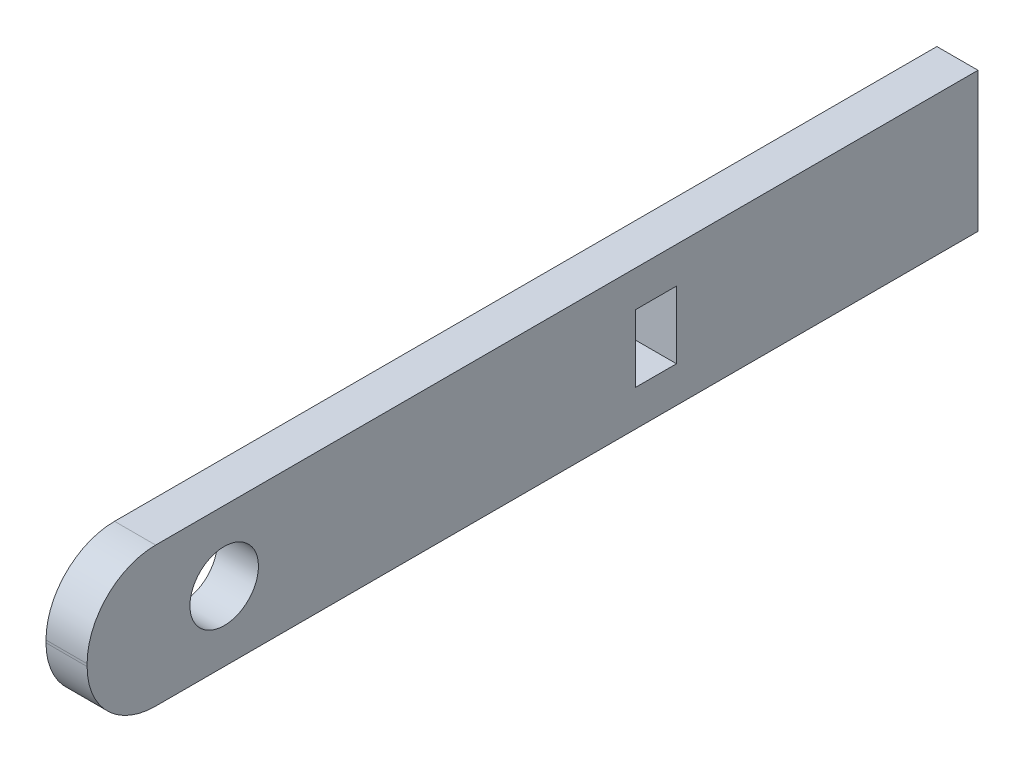
ISO-10303-21;
HEADER;
FILE_DESCRIPTION(('STEP AP214'),'2;1');
FILE_NAME('part.step','',(''),(''),'','','');
FILE_SCHEMA(('AUTOMOTIVE_DESIGN { 1 0 10303 214 1 1 1 1 }'));
ENDSEC;
DATA;
#1=APPLICATION_CONTEXT('core data for automotive mechanical design processes');
#2=APPLICATION_PROTOCOL_DEFINITION('international standard','automotive_design',2000,#1);
#3=PRODUCT_CONTEXT('',#1,'mechanical');
#4=PRODUCT('Part','Part','',(#3));
#5=PRODUCT_RELATED_PRODUCT_CATEGORY('part','',(#4));
#6=PRODUCT_DEFINITION_FORMATION('','',#4);
#7=PRODUCT_DEFINITION_CONTEXT('part definition',#1,'design');
#8=PRODUCT_DEFINITION('design','',#6,#7);
#9=PRODUCT_DEFINITION_SHAPE('','',#8);
#10=(LENGTH_UNIT() NAMED_UNIT(*) SI_UNIT(.MILLI.,.METRE.));
#11=(NAMED_UNIT(*) PLANE_ANGLE_UNIT() SI_UNIT($,.RADIAN.));
#12=(NAMED_UNIT(*) SI_UNIT($,.STERADIAN.) SOLID_ANGLE_UNIT());
#13=UNCERTAINTY_MEASURE_WITH_UNIT(LENGTH_MEASURE(1.E-05),#10,'distance_accuracy_value','');
#14=(GEOMETRIC_REPRESENTATION_CONTEXT(3) GLOBAL_UNCERTAINTY_ASSIGNED_CONTEXT((#13)) GLOBAL_UNIT_ASSIGNED_CONTEXT((#10,
#11,#12)) REPRESENTATION_CONTEXT('',''));
#15=CARTESIAN_POINT('',(0.,0.,0.));
#16=DIRECTION('',(0.,0.,1.));
#17=DIRECTION('',(1.,0.,0.));
#18=AXIS2_PLACEMENT_3D('',#15,#16,#17);
#19=CARTESIAN_POINT('',(3.,0.,0.));
#20=DIRECTION('',(0.,0.,-1.));
#21=DIRECTION('',(-1.,0.,0.));
#22=AXIS2_PLACEMENT_3D('',#19,#20,#21);
#23=PLANE('',#22);
#24=DIRECTION('',(0.,-1.,0.));
#25=VECTOR('',#24,1.);
#26=CARTESIAN_POINT('',(0.,0.,0.));
#27=LINE('',#26,#25);
#28=CARTESIAN_POINT('',(0.,5.18,0.));
#29=VERTEX_POINT('',#28);
#30=CARTESIAN_POINT('',(0.,5.,0.));
#31=VERTEX_POINT('',#30);
#32=EDGE_CURVE('E151',#29,#31,#27,.T.);
#33=ORIENTED_EDGE('',*,*,#32,.T.);
#34=DIRECTION('',(-1.,0.,0.));
#35=VECTOR('',#34,1.);
#36=CARTESIAN_POINT('',(3.,5.,0.));
#37=LINE('',#36,#35);
#38=CARTESIAN_POINT('',(3.,5.,0.));
#39=VERTEX_POINT('',#38);
#40=EDGE_CURVE('E187',#31,#39,#37,.F.);
#41=ORIENTED_EDGE('',*,*,#40,.T.);
#42=DIRECTION('',(0.,-1.,0.));
#43=VECTOR('',#42,1.);
#44=CARTESIAN_POINT('',(3.,0.,0.));
#45=LINE('',#44,#43);
#46=CARTESIAN_POINT('',(3.,5.18,0.));
#47=VERTEX_POINT('',#46);
#48=EDGE_CURVE('E152',#47,#39,#45,.T.);
#49=ORIENTED_EDGE('',*,*,#48,.F.);
#50=DIRECTION('',(-1.,0.,0.));
#51=VECTOR('',#50,1.);
#52=CARTESIAN_POINT('',(3.,5.18,0.));
#53=LINE('',#52,#51);
#54=EDGE_CURVE('E184',#47,#29,#53,.T.);
#55=ORIENTED_EDGE('',*,*,#54,.T.);
#56=EDGE_LOOP('',(#33,#41,#49,#55));
#57=FACE_BOUND('',#56,.T.);
#58=ADVANCED_FACE('F33',(#57),#23,.F.);
#59=CARTESIAN_POINT('',(3.,0.,0.));
#60=DIRECTION('',(0.,1.,0.));
#61=DIRECTION('',(0.,0.,1.));
#62=AXIS2_PLACEMENT_3D('',#59,#60,#61);
#63=PLANE('',#62);
#64=DIRECTION('',(0.,0.,-1.));
#65=VECTOR('',#64,1.);
#66=CARTESIAN_POINT('',(3.,0.,0.));
#67=LINE('',#66,#65);
#68=CARTESIAN_POINT('',(3.,0.,-5.));
#69=VERTEX_POINT('',#68);
#70=CARTESIAN_POINT('',(3.,0.,-65.));
#71=VERTEX_POINT('',#70);
#72=EDGE_CURVE('E155',#69,#71,#67,.T.);
#73=ORIENTED_EDGE('',*,*,#72,.F.);
#74=DIRECTION('',(-1.,0.,0.));
#75=VECTOR('',#74,1.);
#76=CARTESIAN_POINT('',(3.,0.,-5.));
#77=LINE('',#76,#75);
#78=CARTESIAN_POINT('',(0.,0.,-5.));
#79=VERTEX_POINT('',#78);
#80=EDGE_CURVE('E177',#69,#79,#77,.T.);
#81=ORIENTED_EDGE('',*,*,#80,.T.);
#82=DIRECTION('',(0.,0.,-1.));
#83=VECTOR('',#82,1.);
#84=CARTESIAN_POINT('',(0.,0.,0.));
#85=LINE('',#84,#83);
#86=CARTESIAN_POINT('',(0.,0.,-65.));
#87=VERTEX_POINT('',#86);
#88=EDGE_CURVE('E166',#79,#87,#85,.T.);
#89=ORIENTED_EDGE('',*,*,#88,.T.);
#90=DIRECTION('',(-1.,0.,0.));
#91=VECTOR('',#90,1.);
#92=CARTESIAN_POINT('',(3.,0.,-65.));
#93=LINE('',#92,#91);
#94=EDGE_CURVE('E174',#71,#87,#93,.T.);
#95=ORIENTED_EDGE('',*,*,#94,.F.);
#96=EDGE_LOOP('',(#73,#81,#89,#95));
#97=FACE_BOUND('',#96,.T.);
#98=ADVANCED_FACE('F200',(#97),#63,.F.);
#99=CARTESIAN_POINT('',(3.,0.,-65.));
#100=DIRECTION('',(0.,0.,1.));
#101=DIRECTION('',(1.,0.,0.));
#102=AXIS2_PLACEMENT_3D('',#99,#100,#101);
#103=PLANE('',#102);
#104=DIRECTION('',(0.,1.,0.));
#105=VECTOR('',#104,1.);
#106=CARTESIAN_POINT('',(0.,0.,-65.));
#107=LINE('',#106,#105);
#108=CARTESIAN_POINT('',(0.,10.18,-65.));
#109=VERTEX_POINT('',#108);
#110=EDGE_CURVE('E168',#87,#109,#107,.T.);
#111=ORIENTED_EDGE('',*,*,#110,.T.);
#112=DIRECTION('',(-1.,0.,0.));
#113=VECTOR('',#112,1.);
#114=CARTESIAN_POINT('',(3.,10.18,-65.));
#115=LINE('',#114,#113);
#116=CARTESIAN_POINT('',(3.,10.18,-65.));
#117=VERTEX_POINT('',#116);
#118=EDGE_CURVE('E163',#117,#109,#115,.T.);
#119=ORIENTED_EDGE('',*,*,#118,.F.);
#120=DIRECTION('',(0.,1.,0.));
#121=VECTOR('',#120,1.);
#122=CARTESIAN_POINT('',(3.,0.,-65.));
#123=LINE('',#122,#121);
#124=EDGE_CURVE('E158',#71,#117,#123,.T.);
#125=ORIENTED_EDGE('',*,*,#124,.F.);
#126=ORIENTED_EDGE('',*,*,#94,.T.);
#127=EDGE_LOOP('',(#111,#119,#125,#126));
#128=FACE_BOUND('',#127,.T.);
#129=ADVANCED_FACE('F218',(#128),#103,.F.);
#130=CARTESIAN_POINT('',(3.,10.18,0.));
#131=DIRECTION('',(0.,-1.,0.));
#132=DIRECTION('',(0.,0.,-1.));
#133=AXIS2_PLACEMENT_3D('',#130,#131,#132);
#134=PLANE('',#133);
#135=DIRECTION('',(0.,0.,1.));
#136=VECTOR('',#135,1.);
#137=CARTESIAN_POINT('',(0.,10.18,0.));
#138=LINE('',#137,#136);
#139=CARTESIAN_POINT('',(0.,10.18,-5.));
#140=VERTEX_POINT('',#139);
#141=EDGE_CURVE('E156',#109,#140,#138,.T.);
#142=ORIENTED_EDGE('',*,*,#141,.T.);
#143=DIRECTION('',(-1.,0.,0.));
#144=VECTOR('',#143,1.);
#145=CARTESIAN_POINT('',(3.,10.18,-5.));
#146=LINE('',#145,#144);
#147=CARTESIAN_POINT('',(3.,10.18,-5.));
#148=VERTEX_POINT('',#147);
#149=EDGE_CURVE('E11',#140,#148,#146,.F.);
#150=ORIENTED_EDGE('',*,*,#149,.T.);
#151=DIRECTION('',(0.,0.,1.));
#152=VECTOR('',#151,1.);
#153=CARTESIAN_POINT('',(3.,10.18,0.));
#154=LINE('',#153,#152);
#155=EDGE_CURVE('E160',#117,#148,#154,.T.);
#156=ORIENTED_EDGE('',*,*,#155,.F.);
#157=ORIENTED_EDGE('',*,*,#118,.T.);
#158=EDGE_LOOP('',(#142,#150,#156,#157));
#159=FACE_BOUND('',#158,.T.);
#160=ADVANCED_FACE('F214',(#159),#134,.F.);
#161=CARTESIAN_POINT('',(3.,0.,0.));
#162=DIRECTION('',(-1.,0.,0.));
#163=DIRECTION('',(0.,0.,1.));
#164=AXIS2_PLACEMENT_3D('',#161,#162,#163);
#165=PLANE('',#164);
#166=DIRECTION('',(0.,0.,-1.));
#167=VECTOR('',#166,1.);
#168=CARTESIAN_POINT('',(3.,2.635,-40.));
#169=LINE('',#168,#167);
#170=CARTESIAN_POINT('',(3.,2.635,-40.));
#171=VERTEX_POINT('',#170);
#172=CARTESIAN_POINT('',(3.,2.635,-43.));
#173=VERTEX_POINT('',#172);
#174=EDGE_CURVE('E136',#171,#173,#169,.T.);
#175=ORIENTED_EDGE('',*,*,#174,.F.);
#176=DIRECTION('',(0.,-1.,0.));
#177=VECTOR('',#176,1.);
#178=CARTESIAN_POINT('',(3.,2.635,-40.));
#179=LINE('',#178,#177);
#180=CARTESIAN_POINT('',(3.,7.545,-40.));
#181=VERTEX_POINT('',#180);
#182=EDGE_CURVE('E48',#181,#171,#179,.T.);
#183=ORIENTED_EDGE('',*,*,#182,.F.);
#184=DIRECTION('',(0.,0.,1.));
#185=VECTOR('',#184,1.);
#186=CARTESIAN_POINT('',(3.,7.545,-40.));
#187=LINE('',#186,#185);
#188=CARTESIAN_POINT('',(3.,7.545,-43.));
#189=VERTEX_POINT('',#188);
#190=EDGE_CURVE('E127',#189,#181,#187,.T.);
#191=ORIENTED_EDGE('',*,*,#190,.F.);
#192=DIRECTION('',(0.,1.,0.));
#193=VECTOR('',#192,1.);
#194=CARTESIAN_POINT('',(3.,2.635,-43.));
#195=LINE('',#194,#193);
#196=EDGE_CURVE('E130',#173,#189,#195,.T.);
#197=ORIENTED_EDGE('',*,*,#196,.F.);
#198=EDGE_LOOP('',(#175,#183,#191,#197));
#199=FACE_BOUND('',#198,.T.);
#200=CARTESIAN_POINT('',(3.,5.09,-10.));
#201=DIRECTION('',(1.,0.,0.));
#202=DIRECTION('',(0.,0.,-1.));
#203=AXIS2_PLACEMENT_3D('',#200,#201,#202);
#204=CIRCLE('',#203,2.5);
#205=CARTESIAN_POINT('',(3.,5.09,-12.5));
#206=VERTEX_POINT('',#205);
#207=EDGE_CURVE('E142',#206,#206,#204,.T.);
#208=ORIENTED_EDGE('',*,*,#207,.F.);
#209=EDGE_LOOP('',(#208));
#210=FACE_BOUND('',#209,.T.);
#211=ORIENTED_EDGE('',*,*,#48,.T.);
#212=CARTESIAN_POINT('',(3.,5.,-5.));
#213=DIRECTION('',(-1.,0.,0.));
#214=DIRECTION('',(0.,0.,1.));
#215=AXIS2_PLACEMENT_3D('',#212,#213,#214);
#216=CIRCLE('',#215,5.);
#217=EDGE_CURVE('E41',#39,#69,#216,.F.);
#218=ORIENTED_EDGE('',*,*,#217,.T.);
#219=ORIENTED_EDGE('',*,*,#72,.T.);
#220=ORIENTED_EDGE('',*,*,#124,.T.);
#221=ORIENTED_EDGE('',*,*,#155,.T.);
#222=CARTESIAN_POINT('',(3.,5.18,-5.));
#223=DIRECTION('',(-1.,0.,0.));
#224=DIRECTION('',(0.,0.,1.));
#225=AXIS2_PLACEMENT_3D('',#222,#223,#224);
#226=CIRCLE('',#225,5.);
#227=EDGE_CURVE('E189',#148,#47,#226,.F.);
#228=ORIENTED_EDGE('',*,*,#227,.T.);
#229=EDGE_LOOP('',(#211,#218,#219,#220,#221,#228));
#230=FACE_BOUND('',#229,.T.);
#231=ADVANCED_FACE('F193',(#199,#210,#230),#165,.F.);
#232=CARTESIAN_POINT('',(0.,0.,0.));
#233=DIRECTION('',(-1.,0.,0.));
#234=DIRECTION('',(0.,0.,1.));
#235=AXIS2_PLACEMENT_3D('',#232,#233,#234);
#236=PLANE('',#235);
#237=DIRECTION('',(0.,-1.,0.));
#238=VECTOR('',#237,1.);
#239=CARTESIAN_POINT('',(0.,2.635,-40.));
#240=LINE('',#239,#238);
#241=CARTESIAN_POINT('',(0.,7.545,-40.));
#242=VERTEX_POINT('',#241);
#243=CARTESIAN_POINT('',(0.,2.635,-40.));
#244=VERTEX_POINT('',#243);
#245=EDGE_CURVE('E111',#242,#244,#240,.T.);
#246=ORIENTED_EDGE('',*,*,#245,.T.);
#247=DIRECTION('',(0.,0.,-1.));
#248=VECTOR('',#247,1.);
#249=CARTESIAN_POINT('',(0.,2.635,-40.));
#250=LINE('',#249,#248);
#251=CARTESIAN_POINT('',(0.,2.635,-43.));
#252=VERTEX_POINT('',#251);
#253=EDGE_CURVE('E120',#244,#252,#250,.T.);
#254=ORIENTED_EDGE('',*,*,#253,.T.);
#255=DIRECTION('',(0.,1.,0.));
#256=VECTOR('',#255,1.);
#257=CARTESIAN_POINT('',(0.,2.635,-43.));
#258=LINE('',#257,#256);
#259=CARTESIAN_POINT('',(0.,7.545,-43.));
#260=VERTEX_POINT('',#259);
#261=EDGE_CURVE('E56',#252,#260,#258,.T.);
#262=ORIENTED_EDGE('',*,*,#261,.T.);
#263=DIRECTION('',(0.,0.,1.));
#264=VECTOR('',#263,1.);
#265=CARTESIAN_POINT('',(0.,7.545,-40.));
#266=LINE('',#265,#264);
#267=EDGE_CURVE('E117',#260,#242,#266,.T.);
#268=ORIENTED_EDGE('',*,*,#267,.T.);
#269=EDGE_LOOP('',(#246,#254,#262,#268));
#270=FACE_BOUND('',#269,.T.);
#271=CARTESIAN_POINT('',(0.,5.09,-10.));
#272=DIRECTION('',(1.,0.,0.));
#273=DIRECTION('',(0.,0.,-1.));
#274=AXIS2_PLACEMENT_3D('',#271,#272,#273);
#275=CIRCLE('',#274,2.5);
#276=CARTESIAN_POINT('',(0.,5.09,-12.5));
#277=VERTEX_POINT('',#276);
#278=EDGE_CURVE('E148',#277,#277,#275,.T.);
#279=ORIENTED_EDGE('',*,*,#278,.T.);
#280=EDGE_LOOP('',(#279));
#281=FACE_BOUND('',#280,.T.);
#282=ORIENTED_EDGE('',*,*,#88,.F.);
#283=CARTESIAN_POINT('',(0.,5.,-5.));
#284=DIRECTION('',(-1.,0.,0.));
#285=DIRECTION('',(0.,0.,1.));
#286=AXIS2_PLACEMENT_3D('',#283,#284,#285);
#287=CIRCLE('',#286,5.);
#288=EDGE_CURVE('E182',#79,#31,#287,.T.);
#289=ORIENTED_EDGE('',*,*,#288,.T.);
#290=ORIENTED_EDGE('',*,*,#32,.F.);
#291=CARTESIAN_POINT('',(0.,5.18,-5.));
#292=DIRECTION('',(-1.,0.,0.));
#293=DIRECTION('',(0.,0.,1.));
#294=AXIS2_PLACEMENT_3D('',#291,#292,#293);
#295=CIRCLE('',#294,5.);
#296=EDGE_CURVE('E180',#29,#140,#295,.T.);
#297=ORIENTED_EDGE('',*,*,#296,.T.);
#298=ORIENTED_EDGE('',*,*,#141,.F.);
#299=ORIENTED_EDGE('',*,*,#110,.F.);
#300=EDGE_LOOP('',(#282,#289,#290,#297,#298,#299));
#301=FACE_BOUND('',#300,.T.);
#302=ADVANCED_FACE('F124',(#270,#281,#301),#236,.T.);
#303=CARTESIAN_POINT('',(3.,5.09,-10.));
#304=DIRECTION('',(1.,0.,0.));
#305=DIRECTION('',(0.,0.,-1.));
#306=AXIS2_PLACEMENT_3D('',#303,#304,#305);
#307=CYLINDRICAL_SURFACE('',#306,2.5);
#308=ORIENTED_EDGE('',*,*,#278,.F.);
#309=EDGE_LOOP('',(#308));
#310=FACE_BOUND('',#309,.T.);
#311=ORIENTED_EDGE('',*,*,#207,.T.);
#312=EDGE_LOOP('',(#311));
#313=FACE_BOUND('',#312,.T.);
#314=ADVANCED_FACE('F232',(#310,#313),#307,.F.);
#315=CARTESIAN_POINT('',(3.,5.,-5.));
#316=DIRECTION('',(-1.,0.,0.));
#317=DIRECTION('',(0.,0.,1.));
#318=AXIS2_PLACEMENT_3D('',#315,#316,#317);
#319=CYLINDRICAL_SURFACE('',#318,5.);
#320=ORIENTED_EDGE('',*,*,#217,.F.);
#321=ORIENTED_EDGE('',*,*,#40,.F.);
#322=ORIENTED_EDGE('',*,*,#288,.F.);
#323=ORIENTED_EDGE('',*,*,#80,.F.);
#324=EDGE_LOOP('',(#320,#321,#322,#323));
#325=FACE_BOUND('',#324,.T.);
#326=ADVANCED_FACE('F203',(#325),#319,.T.);
#327=CARTESIAN_POINT('',(3.,5.18,-5.));
#328=DIRECTION('',(-1.,0.,0.));
#329=DIRECTION('',(0.,0.,1.));
#330=AXIS2_PLACEMENT_3D('',#327,#328,#329);
#331=CYLINDRICAL_SURFACE('',#330,5.);
#332=ORIENTED_EDGE('',*,*,#227,.F.);
#333=ORIENTED_EDGE('',*,*,#149,.F.);
#334=ORIENTED_EDGE('',*,*,#296,.F.);
#335=ORIENTED_EDGE('',*,*,#54,.F.);
#336=EDGE_LOOP('',(#332,#333,#334,#335));
#337=FACE_BOUND('',#336,.T.);
#338=ADVANCED_FACE('F35',(#337),#331,.T.);
#339=CARTESIAN_POINT('',(0.,2.635,-40.));
#340=DIRECTION('',(0.,0.,1.));
#341=DIRECTION('',(1.,0.,0.));
#342=AXIS2_PLACEMENT_3D('',#339,#340,#341);
#343=PLANE('',#342);
#344=ORIENTED_EDGE('',*,*,#182,.T.);
#345=DIRECTION('',(1.,0.,0.));
#346=VECTOR('',#345,1.);
#347=CARTESIAN_POINT('',(0.,2.635,-40.));
#348=LINE('',#347,#346);
#349=EDGE_CURVE('E107',#244,#171,#348,.T.);
#350=ORIENTED_EDGE('',*,*,#349,.F.);
#351=ORIENTED_EDGE('',*,*,#245,.F.);
#352=DIRECTION('',(1.,0.,0.));
#353=VECTOR('',#352,1.);
#354=CARTESIAN_POINT('',(0.,7.545,-40.));
#355=LINE('',#354,#353);
#356=EDGE_CURVE('E140',#242,#181,#355,.T.);
#357=ORIENTED_EDGE('',*,*,#356,.T.);
#358=EDGE_LOOP('',(#344,#350,#351,#357));
#359=FACE_BOUND('',#358,.T.);
#360=ADVANCED_FACE('F109',(#359),#343,.F.);
#361=CARTESIAN_POINT('',(0.,7.545,-40.));
#362=DIRECTION('',(0.,1.,0.));
#363=DIRECTION('',(0.,0.,1.));
#364=AXIS2_PLACEMENT_3D('',#361,#362,#363);
#365=PLANE('',#364);
#366=ORIENTED_EDGE('',*,*,#190,.T.);
#367=ORIENTED_EDGE('',*,*,#356,.F.);
#368=ORIENTED_EDGE('',*,*,#267,.F.);
#369=DIRECTION('',(1.,0.,0.));
#370=VECTOR('',#369,1.);
#371=CARTESIAN_POINT('',(0.,7.545,-43.));
#372=LINE('',#371,#370);
#373=EDGE_CURVE('E143',#260,#189,#372,.T.);
#374=ORIENTED_EDGE('',*,*,#373,.T.);
#375=EDGE_LOOP('',(#366,#367,#368,#374));
#376=FACE_BOUND('',#375,.T.);
#377=ADVANCED_FACE('F258',(#376),#365,.F.);
#378=CARTESIAN_POINT('',(0.,2.635,-43.));
#379=DIRECTION('',(0.,0.,-1.));
#380=DIRECTION('',(-1.,0.,0.));
#381=AXIS2_PLACEMENT_3D('',#378,#379,#380);
#382=PLANE('',#381);
#383=ORIENTED_EDGE('',*,*,#196,.T.);
#384=ORIENTED_EDGE('',*,*,#373,.F.);
#385=ORIENTED_EDGE('',*,*,#261,.F.);
#386=DIRECTION('',(1.,0.,0.));
#387=VECTOR('',#386,1.);
#388=CARTESIAN_POINT('',(0.,2.635,-43.));
#389=LINE('',#388,#387);
#390=EDGE_CURVE('E116',#252,#173,#389,.T.);
#391=ORIENTED_EDGE('',*,*,#390,.T.);
#392=EDGE_LOOP('',(#383,#384,#385,#391));
#393=FACE_BOUND('',#392,.T.);
#394=ADVANCED_FACE('F256',(#393),#382,.F.);
#395=CARTESIAN_POINT('',(0.,2.635,-40.));
#396=DIRECTION('',(0.,-1.,0.));
#397=DIRECTION('',(0.,0.,-1.));
#398=AXIS2_PLACEMENT_3D('',#395,#396,#397);
#399=PLANE('',#398);
#400=ORIENTED_EDGE('',*,*,#174,.T.);
#401=ORIENTED_EDGE('',*,*,#390,.F.);
#402=ORIENTED_EDGE('',*,*,#253,.F.);
#403=ORIENTED_EDGE('',*,*,#349,.T.);
#404=EDGE_LOOP('',(#400,#401,#402,#403));
#405=FACE_BOUND('',#404,.T.);
#406=ADVANCED_FACE('F121',(#405),#399,.F.);
#407=CLOSED_SHELL('',(#58,#98,#129,#160,#231,#302,#314,#326,#338,#360,#377,#394,#406));
#408=MANIFOLD_SOLID_BREP('B2',#407);
#409=ADVANCED_BREP_SHAPE_REPRESENTATION('',(#18,#408),#14);
#410=SHAPE_DEFINITION_REPRESENTATION(#9,#409);
ENDSEC;
END-ISO-10303-21;
